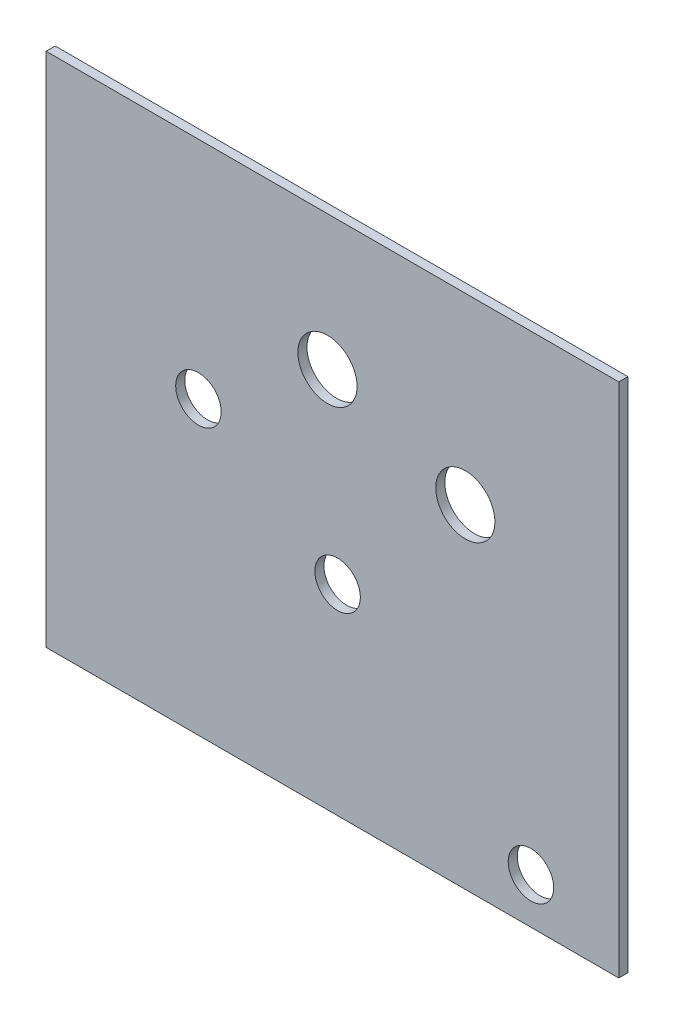
ISO-10303-21;
HEADER;
FILE_DESCRIPTION(('STEP AP214'),'2;1');
FILE_NAME('part.step','',(''),(''),'','','');
FILE_SCHEMA(('AUTOMOTIVE_DESIGN { 1 0 10303 214 1 1 1 1 }'));
ENDSEC;
DATA;
#1=APPLICATION_CONTEXT('core data for automotive mechanical design processes');
#2=APPLICATION_PROTOCOL_DEFINITION('international standard','automotive_design',2000,#1);
#3=PRODUCT_CONTEXT('',#1,'mechanical');
#4=PRODUCT('Part','Part','',(#3));
#5=PRODUCT_RELATED_PRODUCT_CATEGORY('part','',(#4));
#6=PRODUCT_DEFINITION_FORMATION('','',#4);
#7=PRODUCT_DEFINITION_CONTEXT('part definition',#1,'design');
#8=PRODUCT_DEFINITION('design','',#6,#7);
#9=PRODUCT_DEFINITION_SHAPE('','',#8);
#10=(LENGTH_UNIT() NAMED_UNIT(*) SI_UNIT(.MILLI.,.METRE.));
#11=(NAMED_UNIT(*) PLANE_ANGLE_UNIT() SI_UNIT($,.RADIAN.));
#12=(NAMED_UNIT(*) SI_UNIT($,.STERADIAN.) SOLID_ANGLE_UNIT());
#13=UNCERTAINTY_MEASURE_WITH_UNIT(LENGTH_MEASURE(1.E-05),#10,'distance_accuracy_value','');
#14=(GEOMETRIC_REPRESENTATION_CONTEXT(3) GLOBAL_UNCERTAINTY_ASSIGNED_CONTEXT((#13)) GLOBAL_UNIT_ASSIGNED_CONTEXT((#10,
#11,#12)) REPRESENTATION_CONTEXT('',''));
#15=CARTESIAN_POINT('',(0.,0.,0.));
#16=DIRECTION('',(0.,0.,1.));
#17=DIRECTION('',(1.,0.,0.));
#18=AXIS2_PLACEMENT_3D('',#15,#16,#17);
#19=CARTESIAN_POINT('',(0.,0.,2.));
#20=DIRECTION('',(0.,0.,1.));
#21=DIRECTION('',(1.,0.,0.));
#22=AXIS2_PLACEMENT_3D('',#19,#20,#21);
#23=PLANE('',#22);
#24=CARTESIAN_POINT('',(-19.3048961159066,10.,2.));
#25=DIRECTION('',(0.,0.,-1.));
#26=DIRECTION('',(-1.,0.,0.));
#27=AXIS2_PLACEMENT_3D('',#24,#25,#26);
#28=CIRCLE('',#27,5.);
#29=CARTESIAN_POINT('',(-24.3048961159066,10.,2.));
#30=VERTEX_POINT('',#29);
#31=EDGE_CURVE('E121',#30,#30,#28,.T.);
#32=ORIENTED_EDGE('',*,*,#31,.T.);
#33=EDGE_LOOP('',(#32));
#34=FACE_BOUND('',#33,.T.);
#35=CARTESIAN_POINT('',(-61.8106931146693,44.0500738336695,2.));
#36=DIRECTION('',(0.,0.,-1.));
#37=DIRECTION('',(-1.,0.,0.));
#38=AXIS2_PLACEMENT_3D('',#35,#36,#37);
#39=CIRCLE('',#38,5.00000000000001);
#40=CARTESIAN_POINT('',(-66.8106931146693,44.0500738336695,2.));
#41=VERTEX_POINT('',#40);
#42=EDGE_CURVE('E131',#41,#41,#39,.T.);
#43=ORIENTED_EDGE('',*,*,#42,.T.);
#44=EDGE_LOOP('',(#43));
#45=FACE_BOUND('',#44,.T.);
#46=CARTESIAN_POINT('',(-92.396875082033,64.0500738336695,2.));
#47=DIRECTION('',(0.,0.,-1.));
#48=DIRECTION('',(-1.,0.,0.));
#49=AXIS2_PLACEMENT_3D('',#46,#47,#48);
#50=CIRCLE('',#49,5.00000000000001);
#51=CARTESIAN_POINT('',(-97.396875082033,64.0500738336695,2.));
#52=VERTEX_POINT('',#51);
#53=EDGE_CURVE('E125',#52,#52,#50,.T.);
#54=ORIENTED_EDGE('',*,*,#53,.T.);
#55=EDGE_LOOP('',(#54));
#56=FACE_BOUND('',#55,.T.);
#57=CARTESIAN_POINT('',(-33.72962940076,73.2178070928823,2.));
#58=DIRECTION('',(0.,0.,1.));
#59=DIRECTION('',(1.,0.,0.));
#60=AXIS2_PLACEMENT_3D('',#57,#58,#59);
#61=CIRCLE('',#60,6.5);
#62=CARTESIAN_POINT('',(-27.2296294007601,73.2178070928823,2.));
#63=VERTEX_POINT('',#62);
#64=EDGE_CURVE('E115',#63,#63,#61,.T.);
#65=ORIENTED_EDGE('',*,*,#64,.F.);
#66=EDGE_LOOP('',(#65));
#67=FACE_BOUND('',#66,.T.);
#68=DIRECTION('',(0.,1.,0.));
#69=VECTOR('',#68,1.);
#70=CARTESIAN_POINT('',(0.,0.,2.));
#71=LINE('',#70,#69);
#72=CARTESIAN_POINT('',(0.,0.,2.));
#73=VERTEX_POINT('',#72);
#74=CARTESIAN_POINT('',(0.,113.481751874114,2.));
#75=VERTEX_POINT('',#74);
#76=EDGE_CURVE('E86',#73,#75,#71,.T.);
#77=ORIENTED_EDGE('',*,*,#76,.T.);
#78=DIRECTION('',(-1.,0.,0.));
#79=VECTOR('',#78,1.);
#80=CARTESIAN_POINT('',(0.,113.481751874114,2.));
#81=LINE('',#80,#79);
#82=CARTESIAN_POINT('',(-125.870370197527,113.481751874114,2.));
#83=VERTEX_POINT('',#82);
#84=EDGE_CURVE('E81',#75,#83,#81,.T.);
#85=ORIENTED_EDGE('',*,*,#84,.T.);
#86=DIRECTION('',(0.,-1.,0.));
#87=VECTOR('',#86,1.);
#88=CARTESIAN_POINT('',(-125.870370197527,0.,2.));
#89=LINE('',#88,#87);
#90=CARTESIAN_POINT('',(-125.870370197527,0.,2.));
#91=VERTEX_POINT('',#90);
#92=EDGE_CURVE('E84',#83,#91,#89,.T.);
#93=ORIENTED_EDGE('',*,*,#92,.T.);
#94=DIRECTION('',(1.,0.,0.));
#95=VECTOR('',#94,1.);
#96=CARTESIAN_POINT('',(0.,0.,2.));
#97=LINE('',#96,#95);
#98=EDGE_CURVE('E51',#91,#73,#97,.T.);
#99=ORIENTED_EDGE('',*,*,#98,.T.);
#100=EDGE_LOOP('',(#77,#85,#93,#99));
#101=FACE_BOUND('',#100,.T.);
#102=CARTESIAN_POINT('',(-64.0284411944108,83.8380091648836,2.));
#103=DIRECTION('',(0.,0.,1.));
#104=DIRECTION('',(1.,0.,0.));
#105=AXIS2_PLACEMENT_3D('',#102,#103,#104);
#106=CIRCLE('',#105,6.5);
#107=CARTESIAN_POINT('',(-57.5284411944108,83.8380091648836,2.));
#108=VERTEX_POINT('',#107);
#109=EDGE_CURVE('E37',#108,#108,#106,.T.);
#110=ORIENTED_EDGE('',*,*,#109,.F.);
#111=EDGE_LOOP('',(#110));
#112=FACE_BOUND('',#111,.T.);
#113=ADVANCED_FACE('F33',(#34,#45,#56,#67,#101,#112),#23,.T.);
#114=CARTESIAN_POINT('',(0.,0.,2.));
#115=DIRECTION('',(-1.,0.,0.));
#116=DIRECTION('',(0.,0.,1.));
#117=AXIS2_PLACEMENT_3D('',#114,#115,#116);
#118=PLANE('',#117);
#119=DIRECTION('',(0.,1.,0.));
#120=VECTOR('',#119,1.);
#121=CARTESIAN_POINT('',(0.,0.,0.));
#122=LINE('',#121,#120);
#123=CARTESIAN_POINT('',(0.,0.,0.));
#124=VERTEX_POINT('',#123);
#125=CARTESIAN_POINT('',(0.,113.481751874114,0.));
#126=VERTEX_POINT('',#125);
#127=EDGE_CURVE('E99',#124,#126,#122,.T.);
#128=ORIENTED_EDGE('',*,*,#127,.T.);
#129=DIRECTION('',(0.,0.,-1.));
#130=VECTOR('',#129,1.);
#131=CARTESIAN_POINT('',(0.,113.481751874114,2.));
#132=LINE('',#131,#130);
#133=EDGE_CURVE('E11',#75,#126,#132,.T.);
#134=ORIENTED_EDGE('',*,*,#133,.F.);
#135=ORIENTED_EDGE('',*,*,#76,.F.);
#136=DIRECTION('',(0.,0.,-1.));
#137=VECTOR('',#136,1.);
#138=CARTESIAN_POINT('',(0.,0.,2.));
#139=LINE('',#138,#137);
#140=EDGE_CURVE('E95',#73,#124,#139,.T.);
#141=ORIENTED_EDGE('',*,*,#140,.T.);
#142=EDGE_LOOP('',(#128,#134,#135,#141));
#143=FACE_BOUND('',#142,.T.);
#144=ADVANCED_FACE('F35',(#143),#118,.F.);
#145=CARTESIAN_POINT('',(0.,113.481751874114,2.));
#146=DIRECTION('',(0.,-1.,0.));
#147=DIRECTION('',(0.,0.,-1.));
#148=AXIS2_PLACEMENT_3D('',#145,#146,#147);
#149=PLANE('',#148);
#150=DIRECTION('',(-1.,0.,0.));
#151=VECTOR('',#150,1.);
#152=CARTESIAN_POINT('',(0.,113.481751874114,0.));
#153=LINE('',#152,#151);
#154=CARTESIAN_POINT('',(-125.870370197527,113.481751874114,0.));
#155=VERTEX_POINT('',#154);
#156=EDGE_CURVE('E90',#126,#155,#153,.T.);
#157=ORIENTED_EDGE('',*,*,#156,.T.);
#158=DIRECTION('',(0.,0.,-1.));
#159=VECTOR('',#158,1.);
#160=CARTESIAN_POINT('',(-125.870370197527,113.481751874114,2.));
#161=LINE('',#160,#159);
#162=EDGE_CURVE('E43',#83,#155,#161,.T.);
#163=ORIENTED_EDGE('',*,*,#162,.F.);
#164=ORIENTED_EDGE('',*,*,#84,.F.);
#165=ORIENTED_EDGE('',*,*,#133,.T.);
#166=EDGE_LOOP('',(#157,#163,#164,#165));
#167=FACE_BOUND('',#166,.T.);
#168=ADVANCED_FACE('F89',(#167),#149,.F.);
#169=CARTESIAN_POINT('',(-125.870370197527,0.,2.));
#170=DIRECTION('',(1.,0.,0.));
#171=DIRECTION('',(0.,0.,-1.));
#172=AXIS2_PLACEMENT_3D('',#169,#170,#171);
#173=PLANE('',#172);
#174=DIRECTION('',(0.,-1.,0.));
#175=VECTOR('',#174,1.);
#176=CARTESIAN_POINT('',(-125.870370197527,0.,0.));
#177=LINE('',#176,#175);
#178=CARTESIAN_POINT('',(-125.870370197527,0.,0.));
#179=VERTEX_POINT('',#178);
#180=EDGE_CURVE('E68',#155,#179,#177,.T.);
#181=ORIENTED_EDGE('',*,*,#180,.T.);
#182=DIRECTION('',(0.,0.,-1.));
#183=VECTOR('',#182,1.);
#184=CARTESIAN_POINT('',(-125.870370197527,0.,2.));
#185=LINE('',#184,#183);
#186=EDGE_CURVE('E91',#91,#179,#185,.T.);
#187=ORIENTED_EDGE('',*,*,#186,.F.);
#188=ORIENTED_EDGE('',*,*,#92,.F.);
#189=ORIENTED_EDGE('',*,*,#162,.T.);
#190=EDGE_LOOP('',(#181,#187,#188,#189));
#191=FACE_BOUND('',#190,.T.);
#192=ADVANCED_FACE('F93',(#191),#173,.F.);
#193=CARTESIAN_POINT('',(0.,0.,2.));
#194=DIRECTION('',(0.,1.,0.));
#195=DIRECTION('',(0.,0.,1.));
#196=AXIS2_PLACEMENT_3D('',#193,#194,#195);
#197=PLANE('',#196);
#198=DIRECTION('',(1.,0.,0.));
#199=VECTOR('',#198,1.);
#200=CARTESIAN_POINT('',(0.,0.,0.));
#201=LINE('',#200,#199);
#202=EDGE_CURVE('E74',#179,#124,#201,.T.);
#203=ORIENTED_EDGE('',*,*,#202,.T.);
#204=ORIENTED_EDGE('',*,*,#140,.F.);
#205=ORIENTED_EDGE('',*,*,#98,.F.);
#206=ORIENTED_EDGE('',*,*,#186,.T.);
#207=EDGE_LOOP('',(#203,#204,#205,#206));
#208=FACE_BOUND('',#207,.T.);
#209=ADVANCED_FACE('F106',(#208),#197,.F.);
#210=CARTESIAN_POINT('',(0.,0.,0.));
#211=DIRECTION('',(0.,0.,1.));
#212=DIRECTION('',(1.,0.,0.));
#213=AXIS2_PLACEMENT_3D('',#210,#211,#212);
#214=PLANE('',#213);
#215=CARTESIAN_POINT('',(-19.3048961159066,10.,0.));
#216=DIRECTION('',(0.,0.,-1.));
#217=DIRECTION('',(-1.,0.,0.));
#218=AXIS2_PLACEMENT_3D('',#215,#216,#217);
#219=CIRCLE('',#218,5.);
#220=CARTESIAN_POINT('',(-24.3048961159066,10.,0.));
#221=VERTEX_POINT('',#220);
#222=EDGE_CURVE('E134',#221,#221,#219,.T.);
#223=ORIENTED_EDGE('',*,*,#222,.F.);
#224=EDGE_LOOP('',(#223));
#225=FACE_BOUND('',#224,.T.);
#226=CARTESIAN_POINT('',(-61.8106931146693,44.0500738336695,0.));
#227=DIRECTION('',(0.,0.,-1.));
#228=DIRECTION('',(-1.,0.,0.));
#229=AXIS2_PLACEMENT_3D('',#226,#227,#228);
#230=CIRCLE('',#229,5.00000000000001);
#231=CARTESIAN_POINT('',(-66.8106931146693,44.0500738336695,0.));
#232=VERTEX_POINT('',#231);
#233=EDGE_CURVE('E128',#232,#232,#230,.T.);
#234=ORIENTED_EDGE('',*,*,#233,.F.);
#235=EDGE_LOOP('',(#234));
#236=FACE_BOUND('',#235,.T.);
#237=CARTESIAN_POINT('',(-92.396875082033,64.0500738336695,0.));
#238=DIRECTION('',(0.,0.,-1.));
#239=DIRECTION('',(-1.,0.,0.));
#240=AXIS2_PLACEMENT_3D('',#237,#238,#239);
#241=CIRCLE('',#240,5.00000000000001);
#242=CARTESIAN_POINT('',(-97.396875082033,64.0500738336695,0.));
#243=VERTEX_POINT('',#242);
#244=EDGE_CURVE('E122',#243,#243,#241,.T.);
#245=ORIENTED_EDGE('',*,*,#244,.F.);
#246=EDGE_LOOP('',(#245));
#247=FACE_BOUND('',#246,.T.);
#248=CARTESIAN_POINT('',(-33.72962940076,73.2178070928823,0.));
#249=DIRECTION('',(0.,0.,-1.));
#250=DIRECTION('',(-1.,0.,0.));
#251=AXIS2_PLACEMENT_3D('',#248,#249,#250);
#252=CIRCLE('',#251,6.5);
#253=CARTESIAN_POINT('',(-40.22962940076,73.2178070928823,0.));
#254=VERTEX_POINT('',#253);
#255=EDGE_CURVE('E118',#254,#254,#252,.T.);
#256=ORIENTED_EDGE('',*,*,#255,.F.);
#257=EDGE_LOOP('',(#256));
#258=FACE_BOUND('',#257,.T.);
#259=CARTESIAN_POINT('',(-64.0284411944108,83.8380091648836,0.));
#260=DIRECTION('',(0.,0.,-1.));
#261=DIRECTION('',(-1.,0.,0.));
#262=AXIS2_PLACEMENT_3D('',#259,#260,#261);
#263=CIRCLE('',#262,6.5);
#264=CARTESIAN_POINT('',(-70.5284411944108,83.8380091648836,0.));
#265=VERTEX_POINT('',#264);
#266=EDGE_CURVE('E112',#265,#265,#263,.T.);
#267=ORIENTED_EDGE('',*,*,#266,.F.);
#268=EDGE_LOOP('',(#267));
#269=FACE_BOUND('',#268,.T.);
#270=ORIENTED_EDGE('',*,*,#127,.F.);
#271=ORIENTED_EDGE('',*,*,#202,.F.);
#272=ORIENTED_EDGE('',*,*,#180,.F.);
#273=ORIENTED_EDGE('',*,*,#156,.F.);
#274=EDGE_LOOP('',(#270,#271,#272,#273));
#275=FACE_BOUND('',#274,.T.);
#276=ADVANCED_FACE('F109',(#225,#236,#247,#258,#269,#275),#214,.F.);
#277=CARTESIAN_POINT('',(-64.0284411944108,83.8380091648836,0.));
#278=DIRECTION('',(0.,0.,-1.));
#279=DIRECTION('',(-1.,0.,0.));
#280=AXIS2_PLACEMENT_3D('',#277,#278,#279);
#281=CYLINDRICAL_SURFACE('',#280,6.5);
#282=ORIENTED_EDGE('',*,*,#109,.T.);
#283=EDGE_LOOP('',(#282));
#284=FACE_BOUND('',#283,.T.);
#285=ORIENTED_EDGE('',*,*,#266,.T.);
#286=EDGE_LOOP('',(#285));
#287=FACE_BOUND('',#286,.T.);
#288=ADVANCED_FACE('F151',(#284,#287),#281,.F.);
#289=CARTESIAN_POINT('',(-33.72962940076,73.2178070928823,0.));
#290=DIRECTION('',(0.,0.,-1.));
#291=DIRECTION('',(-1.,0.,0.));
#292=AXIS2_PLACEMENT_3D('',#289,#290,#291);
#293=CYLINDRICAL_SURFACE('',#292,6.5);
#294=ORIENTED_EDGE('',*,*,#64,.T.);
#295=EDGE_LOOP('',(#294));
#296=FACE_BOUND('',#295,.T.);
#297=ORIENTED_EDGE('',*,*,#255,.T.);
#298=EDGE_LOOP('',(#297));
#299=FACE_BOUND('',#298,.T.);
#300=ADVANCED_FACE('F162',(#296,#299),#293,.F.);
#301=CARTESIAN_POINT('',(-92.396875082033,64.0500738336695,2.));
#302=DIRECTION('',(0.,0.,-1.));
#303=DIRECTION('',(-1.,0.,0.));
#304=AXIS2_PLACEMENT_3D('',#301,#302,#303);
#305=CYLINDRICAL_SURFACE('',#304,5.00000000000001);
#306=ORIENTED_EDGE('',*,*,#53,.F.);
#307=EDGE_LOOP('',(#306));
#308=FACE_BOUND('',#307,.T.);
#309=ORIENTED_EDGE('',*,*,#244,.T.);
#310=EDGE_LOOP('',(#309));
#311=FACE_BOUND('',#310,.T.);
#312=ADVANCED_FACE('F169',(#308,#311),#305,.F.);
#313=CARTESIAN_POINT('',(-61.8106931146693,44.0500738336695,2.));
#314=DIRECTION('',(0.,0.,-1.));
#315=DIRECTION('',(-1.,0.,0.));
#316=AXIS2_PLACEMENT_3D('',#313,#314,#315);
#317=CYLINDRICAL_SURFACE('',#316,5.00000000000001);
#318=ORIENTED_EDGE('',*,*,#42,.F.);
#319=EDGE_LOOP('',(#318));
#320=FACE_BOUND('',#319,.T.);
#321=ORIENTED_EDGE('',*,*,#233,.T.);
#322=EDGE_LOOP('',(#321));
#323=FACE_BOUND('',#322,.T.);
#324=ADVANCED_FACE('F145',(#320,#323),#317,.F.);
#325=CARTESIAN_POINT('',(-19.3048961159066,10.,2.));
#326=DIRECTION('',(0.,0.,-1.));
#327=DIRECTION('',(-1.,0.,0.));
#328=AXIS2_PLACEMENT_3D('',#325,#326,#327);
#329=CYLINDRICAL_SURFACE('',#328,5.);
#330=ORIENTED_EDGE('',*,*,#31,.F.);
#331=EDGE_LOOP('',(#330));
#332=FACE_BOUND('',#331,.T.);
#333=ORIENTED_EDGE('',*,*,#222,.T.);
#334=EDGE_LOOP('',(#333));
#335=FACE_BOUND('',#334,.T.);
#336=ADVANCED_FACE('F142',(#332,#335),#329,.F.);
#337=CLOSED_SHELL('',(#113,#144,#168,#192,#209,#276,#288,#300,#312,#324,#336));
#338=MANIFOLD_SOLID_BREP('B2',#337);
#339=ADVANCED_BREP_SHAPE_REPRESENTATION('',(#18,#338),#14);
#340=SHAPE_DEFINITION_REPRESENTATION(#9,#339);
ENDSEC;
END-ISO-10303-21;
